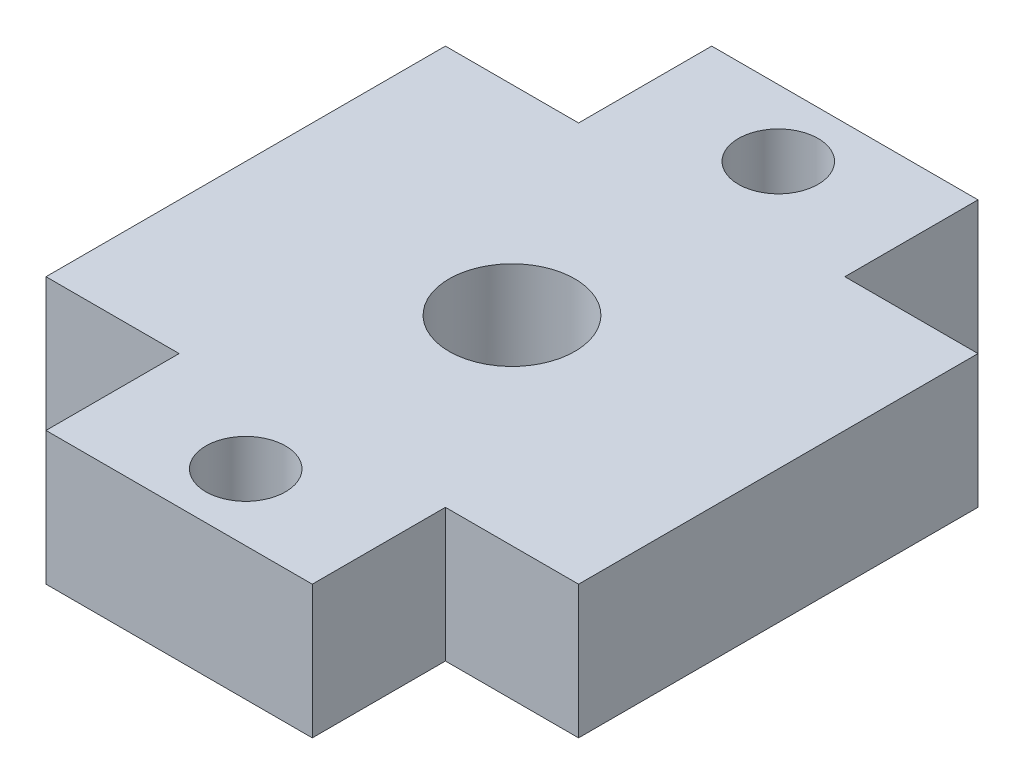
ISO-10303-21;
HEADER;
FILE_DESCRIPTION(('STEP AP214'),'2;1');
FILE_NAME('part.step','',(''),(''),'','','');
FILE_SCHEMA(('AUTOMOTIVE_DESIGN { 1 0 10303 214 1 1 1 1 }'));
ENDSEC;
DATA;
#1=APPLICATION_CONTEXT('core data for automotive mechanical design processes');
#2=APPLICATION_PROTOCOL_DEFINITION('international standard','automotive_design',2000,#1);
#3=PRODUCT_CONTEXT('',#1,'mechanical');
#4=PRODUCT('Part','Part','',(#3));
#5=PRODUCT_RELATED_PRODUCT_CATEGORY('part','',(#4));
#6=PRODUCT_DEFINITION_FORMATION('','',#4);
#7=PRODUCT_DEFINITION_CONTEXT('part definition',#1,'design');
#8=PRODUCT_DEFINITION('design','',#6,#7);
#9=PRODUCT_DEFINITION_SHAPE('','',#8);
#10=(LENGTH_UNIT() NAMED_UNIT(*) SI_UNIT(.MILLI.,.METRE.));
#11=(NAMED_UNIT(*) PLANE_ANGLE_UNIT() SI_UNIT($,.RADIAN.));
#12=(NAMED_UNIT(*) SI_UNIT($,.STERADIAN.) SOLID_ANGLE_UNIT());
#13=UNCERTAINTY_MEASURE_WITH_UNIT(LENGTH_MEASURE(1.E-05),#10,'distance_accuracy_value','');
#14=(GEOMETRIC_REPRESENTATION_CONTEXT(3) GLOBAL_UNCERTAINTY_ASSIGNED_CONTEXT((#13)) GLOBAL_UNIT_ASSIGNED_CONTEXT((#10,
#11,#12)) REPRESENTATION_CONTEXT('',''));
#15=CARTESIAN_POINT('',(0.,0.,0.));
#16=DIRECTION('',(0.,0.,1.));
#17=DIRECTION('',(1.,0.,0.));
#18=AXIS2_PLACEMENT_3D('',#15,#16,#17);
#19=CARTESIAN_POINT('',(0.,3.175,0.));
#20=DIRECTION('',(0.,-1.,0.));
#21=DIRECTION('',(0.,0.,-1.));
#22=AXIS2_PLACEMENT_3D('',#19,#20,#21);
#23=PLANE('',#22);
#24=CARTESIAN_POINT('',(0.,3.175,0.));
#25=DIRECTION('',(0.,1.,0.));
#26=DIRECTION('',(0.,0.,1.));
#27=AXIS2_PLACEMENT_3D('',#24,#25,#26);
#28=CIRCLE('',#27,3.);
#29=CARTESIAN_POINT('',(0.,3.175,3.));
#30=VERTEX_POINT('',#29);
#31=EDGE_CURVE('E415',#30,#30,#28,.T.);
#32=ORIENTED_EDGE('',*,*,#31,.F.);
#33=EDGE_LOOP('',(#32));
#34=FACE_BOUND('',#33,.T.);
#35=CARTESIAN_POINT('',(0.,3.175,-12.7));
#36=DIRECTION('',(0.,1.,0.));
#37=DIRECTION('',(0.,0.,1.));
#38=AXIS2_PLACEMENT_3D('',#35,#36,#37);
#39=CIRCLE('',#38,1.89864999999999);
#40=CARTESIAN_POINT('',(0.,3.175,-10.80135));
#41=VERTEX_POINT('',#40);
#42=EDGE_CURVE('E428',#41,#41,#39,.T.);
#43=ORIENTED_EDGE('',*,*,#42,.F.);
#44=EDGE_LOOP('',(#43));
#45=FACE_BOUND('',#44,.T.);
#46=DIRECTION('',(-1.,0.,0.));
#47=VECTOR('',#46,1.);
#48=CARTESIAN_POINT('',(12.7,3.175,-9.525));
#49=LINE('',#48,#47);
#50=CARTESIAN_POINT('',(12.7,3.175,-9.525));
#51=VERTEX_POINT('',#50);
#52=CARTESIAN_POINT('',(6.34999999999999,3.175,-9.525));
#53=VERTEX_POINT('',#52);
#54=EDGE_CURVE('E152',#51,#53,#49,.T.);
#55=ORIENTED_EDGE('',*,*,#54,.T.);
#56=DIRECTION('',(0.,0.,-1.));
#57=VECTOR('',#56,1.);
#58=CARTESIAN_POINT('',(6.35,3.175,-15.875));
#59=LINE('',#58,#57);
#60=CARTESIAN_POINT('',(6.35,3.175,-15.875));
#61=VERTEX_POINT('',#60);
#62=EDGE_CURVE('E146',#53,#61,#59,.T.);
#63=ORIENTED_EDGE('',*,*,#62,.T.);
#64=DIRECTION('',(-1.,0.,0.));
#65=VECTOR('',#64,1.);
#66=CARTESIAN_POINT('',(-12.7,3.175,-15.875));
#67=LINE('',#66,#65);
#68=CARTESIAN_POINT('',(-6.35,3.175,-15.875));
#69=VERTEX_POINT('',#68);
#70=EDGE_CURVE('E157',#61,#69,#67,.T.);
#71=ORIENTED_EDGE('',*,*,#70,.T.);
#72=DIRECTION('',(0.,0.,-1.));
#73=VECTOR('',#72,1.);
#74=CARTESIAN_POINT('',(-6.35,3.175,-15.875));
#75=LINE('',#74,#73);
#76=CARTESIAN_POINT('',(-6.34999999999999,3.175,-9.525));
#77=VERTEX_POINT('',#76);
#78=EDGE_CURVE('E261',#77,#69,#75,.T.);
#79=ORIENTED_EDGE('',*,*,#78,.F.);
#80=DIRECTION('',(1.,0.,0.));
#81=VECTOR('',#80,1.);
#82=CARTESIAN_POINT('',(-12.7,3.175,-9.525));
#83=LINE('',#82,#81);
#84=CARTESIAN_POINT('',(-12.7,3.175,-9.525));
#85=VERTEX_POINT('',#84);
#86=EDGE_CURVE('E258',#85,#77,#83,.T.);
#87=ORIENTED_EDGE('',*,*,#86,.F.);
#88=DIRECTION('',(0.,0.,1.));
#89=VECTOR('',#88,1.);
#90=CARTESIAN_POINT('',(-12.7,3.175,15.875));
#91=LINE('',#90,#89);
#92=CARTESIAN_POINT('',(-12.7,3.175,9.525));
#93=VERTEX_POINT('',#92);
#94=EDGE_CURVE('E48',#85,#93,#91,.T.);
#95=ORIENTED_EDGE('',*,*,#94,.T.);
#96=DIRECTION('',(1.,0.,0.));
#97=VECTOR('',#96,1.);
#98=CARTESIAN_POINT('',(-12.7,3.175,9.525));
#99=LINE('',#98,#97);
#100=CARTESIAN_POINT('',(-6.34999999999999,3.175,9.525));
#101=VERTEX_POINT('',#100);
#102=EDGE_CURVE('E244',#93,#101,#99,.T.);
#103=ORIENTED_EDGE('',*,*,#102,.T.);
#104=DIRECTION('',(0.,0.,1.));
#105=VECTOR('',#104,1.);
#106=CARTESIAN_POINT('',(-6.35,3.175,15.875));
#107=LINE('',#106,#105);
#108=CARTESIAN_POINT('',(-6.35,3.175,15.875));
#109=VERTEX_POINT('',#108);
#110=EDGE_CURVE('E240',#101,#109,#107,.T.);
#111=ORIENTED_EDGE('',*,*,#110,.T.);
#112=DIRECTION('',(1.,0.,0.));
#113=VECTOR('',#112,1.);
#114=CARTESIAN_POINT('',(-12.7,3.175,15.875));
#115=LINE('',#114,#113);
#116=CARTESIAN_POINT('',(6.35,3.175,15.875));
#117=VERTEX_POINT('',#116);
#118=EDGE_CURVE('E11',#109,#117,#115,.T.);
#119=ORIENTED_EDGE('',*,*,#118,.T.);
#120=DIRECTION('',(0.,0.,1.));
#121=VECTOR('',#120,1.);
#122=CARTESIAN_POINT('',(6.35,3.175,15.875));
#123=LINE('',#122,#121);
#124=CARTESIAN_POINT('',(6.34999999999999,3.175,9.525));
#125=VERTEX_POINT('',#124);
#126=EDGE_CURVE('E218',#125,#117,#123,.T.);
#127=ORIENTED_EDGE('',*,*,#126,.F.);
#128=DIRECTION('',(-1.,0.,0.));
#129=VECTOR('',#128,1.);
#130=CARTESIAN_POINT('',(12.7,3.175,9.525));
#131=LINE('',#130,#129);
#132=CARTESIAN_POINT('',(12.7,3.175,9.525));
#133=VERTEX_POINT('',#132);
#134=EDGE_CURVE('E211',#133,#125,#131,.T.);
#135=ORIENTED_EDGE('',*,*,#134,.F.);
#136=DIRECTION('',(0.,0.,-1.));
#137=VECTOR('',#136,1.);
#138=CARTESIAN_POINT('',(12.7,3.175,15.875));
#139=LINE('',#138,#137);
#140=EDGE_CURVE('E167',#133,#51,#139,.T.);
#141=ORIENTED_EDGE('',*,*,#140,.T.);
#142=EDGE_LOOP('',(#55,#63,#71,#79,#87,#95,#103,#111,#119,#127,#135,#141));
#143=FACE_BOUND('',#142,.T.);
#144=CARTESIAN_POINT('',(0.,3.175,12.7));
#145=DIRECTION('',(0.,1.,0.));
#146=DIRECTION('',(0.,0.,1.));
#147=AXIS2_PLACEMENT_3D('',#144,#145,#146);
#148=CIRCLE('',#147,1.89864999999999);
#149=CARTESIAN_POINT('',(0.,3.175,14.59865));
#150=VERTEX_POINT('',#149);
#151=EDGE_CURVE('E417',#150,#150,#148,.T.);
#152=ORIENTED_EDGE('',*,*,#151,.F.);
#153=EDGE_LOOP('',(#152));
#154=FACE_BOUND('',#153,.T.);
#155=ADVANCED_FACE('F38',(#34,#45,#143,#154),#23,.F.);
#156=CARTESIAN_POINT('',(0.,-3.175,0.));
#157=DIRECTION('',(0.,-1.,0.));
#158=DIRECTION('',(0.,0.,-1.));
#159=AXIS2_PLACEMENT_3D('',#156,#157,#158);
#160=PLANE('',#159);
#161=CARTESIAN_POINT('',(0.,-3.175,0.));
#162=DIRECTION('',(0.,-1.,0.));
#163=DIRECTION('',(0.,0.,-1.));
#164=AXIS2_PLACEMENT_3D('',#161,#162,#163);
#165=CIRCLE('',#164,3.);
#166=CARTESIAN_POINT('',(0.,-3.175,-3.));
#167=VERTEX_POINT('',#166);
#168=EDGE_CURVE('E413',#167,#167,#165,.F.);
#169=ORIENTED_EDGE('',*,*,#168,.T.);
#170=EDGE_LOOP('',(#169));
#171=FACE_BOUND('',#170,.T.);
#172=CARTESIAN_POINT('',(0.,-3.17499999999999,12.7));
#173=DIRECTION('',(0.,1.,0.));
#174=DIRECTION('',(0.,0.,1.));
#175=AXIS2_PLACEMENT_3D('',#172,#173,#174);
#176=CIRCLE('',#175,1.89864999999999);
#177=CARTESIAN_POINT('',(0.,-3.17499999999999,14.59865));
#178=VERTEX_POINT('',#177);
#179=EDGE_CURVE('E422',#178,#178,#176,.T.);
#180=ORIENTED_EDGE('',*,*,#179,.T.);
#181=EDGE_LOOP('',(#180));
#182=FACE_BOUND('',#181,.T.);
#183=CARTESIAN_POINT('',(0.,-3.17499999999999,-12.7));
#184=DIRECTION('',(0.,1.,0.));
#185=DIRECTION('',(0.,0.,1.));
#186=AXIS2_PLACEMENT_3D('',#183,#184,#185);
#187=CIRCLE('',#186,1.89864999999999);
#188=CARTESIAN_POINT('',(0.,-3.17499999999999,-10.80135));
#189=VERTEX_POINT('',#188);
#190=EDGE_CURVE('E313',#189,#189,#187,.T.);
#191=ORIENTED_EDGE('',*,*,#190,.T.);
#192=EDGE_LOOP('',(#191));
#193=FACE_BOUND('',#192,.T.);
#194=DIRECTION('',(0.,0.,-1.));
#195=VECTOR('',#194,1.);
#196=CARTESIAN_POINT('',(6.35,-3.175,-15.875));
#197=LINE('',#196,#195);
#198=CARTESIAN_POINT('',(6.34999999999999,-3.175,-9.525));
#199=VERTEX_POINT('',#198);
#200=CARTESIAN_POINT('',(6.34999999999999,-3.175,-15.875));
#201=VERTEX_POINT('',#200);
#202=EDGE_CURVE('E56',#199,#201,#197,.T.);
#203=ORIENTED_EDGE('',*,*,#202,.F.);
#204=DIRECTION('',(-1.,0.,0.));
#205=VECTOR('',#204,1.);
#206=CARTESIAN_POINT('',(12.7,-3.175,-9.525));
#207=LINE('',#206,#205);
#208=CARTESIAN_POINT('',(12.7,-3.175,-9.525));
#209=VERTEX_POINT('',#208);
#210=EDGE_CURVE('E161',#209,#199,#207,.T.);
#211=ORIENTED_EDGE('',*,*,#210,.F.);
#212=DIRECTION('',(0.,0.,-1.));
#213=VECTOR('',#212,1.);
#214=CARTESIAN_POINT('',(12.7,-3.175,15.875));
#215=LINE('',#214,#213);
#216=CARTESIAN_POINT('',(12.7,-3.175,9.525));
#217=VERTEX_POINT('',#216);
#218=EDGE_CURVE('E176',#217,#209,#215,.T.);
#219=ORIENTED_EDGE('',*,*,#218,.F.);
#220=DIRECTION('',(-1.,0.,0.));
#221=VECTOR('',#220,1.);
#222=CARTESIAN_POINT('',(12.7,-3.175,9.525));
#223=LINE('',#222,#221);
#224=CARTESIAN_POINT('',(6.34999999999999,-3.175,9.525));
#225=VERTEX_POINT('',#224);
#226=EDGE_CURVE('E67',#217,#225,#223,.T.);
#227=ORIENTED_EDGE('',*,*,#226,.T.);
#228=DIRECTION('',(0.,0.,1.));
#229=VECTOR('',#228,1.);
#230=CARTESIAN_POINT('',(6.35,-3.175,15.875));
#231=LINE('',#230,#229);
#232=CARTESIAN_POINT('',(6.34999999999999,-3.175,15.875));
#233=VERTEX_POINT('',#232);
#234=EDGE_CURVE('E207',#225,#233,#231,.T.);
#235=ORIENTED_EDGE('',*,*,#234,.T.);
#236=DIRECTION('',(1.,0.,0.));
#237=VECTOR('',#236,1.);
#238=CARTESIAN_POINT('',(-12.7,-3.175,15.875));
#239=LINE('',#238,#237);
#240=CARTESIAN_POINT('',(-6.35,-3.175,15.875));
#241=VERTEX_POINT('',#240);
#242=EDGE_CURVE('E42',#241,#233,#239,.T.);
#243=ORIENTED_EDGE('',*,*,#242,.F.);
#244=DIRECTION('',(0.,0.,1.));
#245=VECTOR('',#244,1.);
#246=CARTESIAN_POINT('',(-6.35,-3.175,15.875));
#247=LINE('',#246,#245);
#248=CARTESIAN_POINT('',(-6.34999999999999,-3.175,9.525));
#249=VERTEX_POINT('',#248);
#250=EDGE_CURVE('E206',#249,#241,#247,.T.);
#251=ORIENTED_EDGE('',*,*,#250,.F.);
#252=DIRECTION('',(1.,0.,0.));
#253=VECTOR('',#252,1.);
#254=CARTESIAN_POINT('',(-12.7,-3.175,9.525));
#255=LINE('',#254,#253);
#256=CARTESIAN_POINT('',(-12.7,-3.175,9.525));
#257=VERTEX_POINT('',#256);
#258=EDGE_CURVE('E237',#257,#249,#255,.T.);
#259=ORIENTED_EDGE('',*,*,#258,.F.);
#260=DIRECTION('',(0.,0.,1.));
#261=VECTOR('',#260,1.);
#262=CARTESIAN_POINT('',(-12.7,-3.175,15.875));
#263=LINE('',#262,#261);
#264=CARTESIAN_POINT('',(-12.7,-3.175,-9.525));
#265=VERTEX_POINT('',#264);
#266=EDGE_CURVE('E182',#265,#257,#263,.T.);
#267=ORIENTED_EDGE('',*,*,#266,.F.);
#268=DIRECTION('',(1.,0.,0.));
#269=VECTOR('',#268,1.);
#270=CARTESIAN_POINT('',(-12.7,-3.175,-9.525));
#271=LINE('',#270,#269);
#272=CARTESIAN_POINT('',(-6.34999999999999,-3.175,-9.525));
#273=VERTEX_POINT('',#272);
#274=EDGE_CURVE('E181',#265,#273,#271,.T.);
#275=ORIENTED_EDGE('',*,*,#274,.T.);
#276=DIRECTION('',(0.,0.,-1.));
#277=VECTOR('',#276,1.);
#278=CARTESIAN_POINT('',(-6.35,-3.175,-15.875));
#279=LINE('',#278,#277);
#280=CARTESIAN_POINT('',(-6.35,-3.175,-15.875));
#281=VERTEX_POINT('',#280);
#282=EDGE_CURVE('E251',#273,#281,#279,.T.);
#283=ORIENTED_EDGE('',*,*,#282,.T.);
#284=DIRECTION('',(-1.,0.,0.));
#285=VECTOR('',#284,1.);
#286=CARTESIAN_POINT('',(-12.7,-3.175,-15.875));
#287=LINE('',#286,#285);
#288=EDGE_CURVE('E180',#201,#281,#287,.T.);
#289=ORIENTED_EDGE('',*,*,#288,.F.);
#290=EDGE_LOOP('',(#203,#211,#219,#227,#235,#243,#251,#259,#267,#275,#283,#289));
#291=FACE_BOUND('',#290,.T.);
#292=ADVANCED_FACE('F204',(#171,#182,#193,#291),#160,.T.);
#293=CARTESIAN_POINT('',(12.7,3.175,15.875));
#294=DIRECTION('',(-1.,0.,0.));
#295=DIRECTION('',(0.,0.,1.));
#296=AXIS2_PLACEMENT_3D('',#293,#294,#295);
#297=PLANE('',#296);
#298=DIRECTION('',(0.,1.,0.));
#299=VECTOR('',#298,1.);
#300=CARTESIAN_POINT('',(12.7,-3.176,-9.525));
#301=LINE('',#300,#299);
#302=EDGE_CURVE('E212',#209,#51,#301,.T.);
#303=ORIENTED_EDGE('',*,*,#302,.T.);
#304=ORIENTED_EDGE('',*,*,#140,.F.);
#305=DIRECTION('',(0.,1.,0.));
#306=VECTOR('',#305,1.);
#307=CARTESIAN_POINT('',(12.7,-3.176,9.525));
#308=LINE('',#307,#306);
#309=EDGE_CURVE('E227',#217,#133,#308,.T.);
#310=ORIENTED_EDGE('',*,*,#309,.F.);
#311=ORIENTED_EDGE('',*,*,#218,.T.);
#312=EDGE_LOOP('',(#303,#304,#310,#311));
#313=FACE_BOUND('',#312,.T.);
#314=ADVANCED_FACE('F40',(#313),#297,.F.);
#315=CARTESIAN_POINT('',(-12.7,3.175,-15.875));
#316=DIRECTION('',(0.,0.,1.));
#317=DIRECTION('',(1.,0.,0.));
#318=AXIS2_PLACEMENT_3D('',#315,#316,#317);
#319=PLANE('',#318);
#320=DIRECTION('',(0.,1.,0.));
#321=VECTOR('',#320,1.);
#322=CARTESIAN_POINT('',(6.35,-3.176,-15.875));
#323=LINE('',#322,#321);
#324=EDGE_CURVE('E143',#201,#61,#323,.T.);
#325=ORIENTED_EDGE('',*,*,#324,.F.);
#326=ORIENTED_EDGE('',*,*,#288,.T.);
#327=DIRECTION('',(0.,1.,0.));
#328=VECTOR('',#327,1.);
#329=CARTESIAN_POINT('',(-6.35,-3.176,-15.875));
#330=LINE('',#329,#328);
#331=EDGE_CURVE('E166',#281,#69,#330,.T.);
#332=ORIENTED_EDGE('',*,*,#331,.T.);
#333=ORIENTED_EDGE('',*,*,#70,.F.);
#334=EDGE_LOOP('',(#325,#326,#332,#333));
#335=FACE_BOUND('',#334,.T.);
#336=ADVANCED_FACE('F164',(#335),#319,.F.);
#337=CARTESIAN_POINT('',(-12.7,3.175,15.875));
#338=DIRECTION('',(1.,0.,0.));
#339=DIRECTION('',(0.,0.,-1.));
#340=AXIS2_PLACEMENT_3D('',#337,#338,#339);
#341=PLANE('',#340);
#342=DIRECTION('',(0.,1.,0.));
#343=VECTOR('',#342,1.);
#344=CARTESIAN_POINT('',(-12.7,-3.176,9.525));
#345=LINE('',#344,#343);
#346=EDGE_CURVE('E248',#257,#93,#345,.T.);
#347=ORIENTED_EDGE('',*,*,#346,.T.);
#348=ORIENTED_EDGE('',*,*,#94,.F.);
#349=DIRECTION('',(0.,1.,0.));
#350=VECTOR('',#349,1.);
#351=CARTESIAN_POINT('',(-12.7,-3.176,-9.525));
#352=LINE('',#351,#350);
#353=EDGE_CURVE('E263',#265,#85,#352,.T.);
#354=ORIENTED_EDGE('',*,*,#353,.F.);
#355=ORIENTED_EDGE('',*,*,#266,.T.);
#356=EDGE_LOOP('',(#347,#348,#354,#355));
#357=FACE_BOUND('',#356,.T.);
#358=ADVANCED_FACE('F273',(#357),#341,.F.);
#359=CARTESIAN_POINT('',(-12.7,3.175,15.875));
#360=DIRECTION('',(0.,0.,-1.));
#361=DIRECTION('',(-1.,0.,0.));
#362=AXIS2_PLACEMENT_3D('',#359,#360,#361);
#363=PLANE('',#362);
#364=ORIENTED_EDGE('',*,*,#242,.T.);
#365=DIRECTION('',(0.,1.,0.));
#366=VECTOR('',#365,1.);
#367=CARTESIAN_POINT('',(6.35,-3.176,15.875));
#368=LINE('',#367,#366);
#369=EDGE_CURVE('E199',#233,#117,#368,.T.);
#370=ORIENTED_EDGE('',*,*,#369,.T.);
#371=ORIENTED_EDGE('',*,*,#118,.F.);
#372=DIRECTION('',(0.,1.,0.));
#373=VECTOR('',#372,1.);
#374=CARTESIAN_POINT('',(-6.35,-3.176,15.875));
#375=LINE('',#374,#373);
#376=EDGE_CURVE('E200',#241,#109,#375,.T.);
#377=ORIENTED_EDGE('',*,*,#376,.F.);
#378=EDGE_LOOP('',(#364,#370,#371,#377));
#379=FACE_BOUND('',#378,.T.);
#380=ADVANCED_FACE('F197',(#379),#363,.F.);
#381=CARTESIAN_POINT('',(-6.35,-3.176,-15.875));
#382=DIRECTION('',(1.,0.,0.));
#383=DIRECTION('',(0.,0.,-1.));
#384=AXIS2_PLACEMENT_3D('',#381,#382,#383);
#385=PLANE('',#384);
#386=DIRECTION('',(0.,1.,0.));
#387=VECTOR('',#386,1.);
#388=CARTESIAN_POINT('',(-6.34999999999999,-3.176,-9.525));
#389=LINE('',#388,#387);
#390=EDGE_CURVE('E265',#273,#77,#389,.T.);
#391=ORIENTED_EDGE('',*,*,#390,.T.);
#392=ORIENTED_EDGE('',*,*,#78,.T.);
#393=ORIENTED_EDGE('',*,*,#331,.F.);
#394=ORIENTED_EDGE('',*,*,#282,.F.);
#395=EDGE_LOOP('',(#391,#392,#393,#394));
#396=FACE_BOUND('',#395,.T.);
#397=ADVANCED_FACE('F275',(#396),#385,.F.);
#398=CARTESIAN_POINT('',(-12.7,-3.176,-9.525));
#399=DIRECTION('',(0.,0.,1.));
#400=DIRECTION('',(1.,0.,0.));
#401=AXIS2_PLACEMENT_3D('',#398,#399,#400);
#402=PLANE('',#401);
#403=ORIENTED_EDGE('',*,*,#353,.T.);
#404=ORIENTED_EDGE('',*,*,#86,.T.);
#405=ORIENTED_EDGE('',*,*,#390,.F.);
#406=ORIENTED_EDGE('',*,*,#274,.F.);
#407=EDGE_LOOP('',(#403,#404,#405,#406));
#408=FACE_BOUND('',#407,.T.);
#409=ADVANCED_FACE('F270',(#408),#402,.F.);
#410=CARTESIAN_POINT('',(-12.7,-3.176,9.525));
#411=DIRECTION('',(0.,0.,1.));
#412=DIRECTION('',(1.,0.,0.));
#413=AXIS2_PLACEMENT_3D('',#410,#411,#412);
#414=PLANE('',#413);
#415=ORIENTED_EDGE('',*,*,#258,.T.);
#416=DIRECTION('',(0.,1.,0.));
#417=VECTOR('',#416,1.);
#418=CARTESIAN_POINT('',(-6.34999999999999,-3.176,9.525));
#419=LINE('',#418,#417);
#420=EDGE_CURVE('E252',#249,#101,#419,.T.);
#421=ORIENTED_EDGE('',*,*,#420,.T.);
#422=ORIENTED_EDGE('',*,*,#102,.F.);
#423=ORIENTED_EDGE('',*,*,#346,.F.);
#424=EDGE_LOOP('',(#415,#421,#422,#423));
#425=FACE_BOUND('',#424,.T.);
#426=ADVANCED_FACE('F282',(#425),#414,.T.);
#427=CARTESIAN_POINT('',(-6.35,-3.176,15.875));
#428=DIRECTION('',(-1.,0.,0.));
#429=DIRECTION('',(0.,0.,1.));
#430=AXIS2_PLACEMENT_3D('',#427,#428,#429);
#431=PLANE('',#430);
#432=ORIENTED_EDGE('',*,*,#250,.T.);
#433=ORIENTED_EDGE('',*,*,#376,.T.);
#434=ORIENTED_EDGE('',*,*,#110,.F.);
#435=ORIENTED_EDGE('',*,*,#420,.F.);
#436=EDGE_LOOP('',(#432,#433,#434,#435));
#437=FACE_BOUND('',#436,.T.);
#438=ADVANCED_FACE('F334',(#437),#431,.T.);
#439=CARTESIAN_POINT('',(6.35,-3.176,15.875));
#440=DIRECTION('',(-1.,0.,0.));
#441=DIRECTION('',(0.,0.,1.));
#442=AXIS2_PLACEMENT_3D('',#439,#440,#441);
#443=PLANE('',#442);
#444=DIRECTION('',(0.,1.,0.));
#445=VECTOR('',#444,1.);
#446=CARTESIAN_POINT('',(6.34999999999999,-3.176,9.525));
#447=LINE('',#446,#445);
#448=EDGE_CURVE('E229',#225,#125,#447,.T.);
#449=ORIENTED_EDGE('',*,*,#448,.T.);
#450=ORIENTED_EDGE('',*,*,#126,.T.);
#451=ORIENTED_EDGE('',*,*,#369,.F.);
#452=ORIENTED_EDGE('',*,*,#234,.F.);
#453=EDGE_LOOP('',(#449,#450,#451,#452));
#454=FACE_BOUND('',#453,.T.);
#455=ADVANCED_FACE('F328',(#454),#443,.F.);
#456=CARTESIAN_POINT('',(12.7,-3.176,9.525));
#457=DIRECTION('',(0.,0.,-1.));
#458=DIRECTION('',(-1.,0.,0.));
#459=AXIS2_PLACEMENT_3D('',#456,#457,#458);
#460=PLANE('',#459);
#461=ORIENTED_EDGE('',*,*,#309,.T.);
#462=ORIENTED_EDGE('',*,*,#134,.T.);
#463=ORIENTED_EDGE('',*,*,#448,.F.);
#464=ORIENTED_EDGE('',*,*,#226,.F.);
#465=EDGE_LOOP('',(#461,#462,#463,#464));
#466=FACE_BOUND('',#465,.T.);
#467=ADVANCED_FACE('F311',(#466),#460,.F.);
#468=CARTESIAN_POINT('',(12.7,-3.176,-9.525));
#469=DIRECTION('',(0.,0.,-1.));
#470=DIRECTION('',(-1.,0.,0.));
#471=AXIS2_PLACEMENT_3D('',#468,#469,#470);
#472=PLANE('',#471);
#473=ORIENTED_EDGE('',*,*,#210,.T.);
#474=DIRECTION('',(0.,1.,0.));
#475=VECTOR('',#474,1.);
#476=CARTESIAN_POINT('',(6.34999999999999,-3.176,-9.525));
#477=LINE('',#476,#475);
#478=EDGE_CURVE('E151',#199,#53,#477,.T.);
#479=ORIENTED_EDGE('',*,*,#478,.T.);
#480=ORIENTED_EDGE('',*,*,#54,.F.);
#481=ORIENTED_EDGE('',*,*,#302,.F.);
#482=EDGE_LOOP('',(#473,#479,#480,#481));
#483=FACE_BOUND('',#482,.T.);
#484=ADVANCED_FACE('F319',(#483),#472,.T.);
#485=CARTESIAN_POINT('',(6.35,-3.176,-15.875));
#486=DIRECTION('',(1.,0.,0.));
#487=DIRECTION('',(0.,0.,-1.));
#488=AXIS2_PLACEMENT_3D('',#485,#486,#487);
#489=PLANE('',#488);
#490=ORIENTED_EDGE('',*,*,#202,.T.);
#491=ORIENTED_EDGE('',*,*,#324,.T.);
#492=ORIENTED_EDGE('',*,*,#62,.F.);
#493=ORIENTED_EDGE('',*,*,#478,.F.);
#494=EDGE_LOOP('',(#490,#491,#492,#493));
#495=FACE_BOUND('',#494,.T.);
#496=ADVANCED_FACE('F145',(#495),#489,.T.);
#497=CARTESIAN_POINT('',(0.,3.175,-12.7));
#498=DIRECTION('',(0.,1.,0.));
#499=DIRECTION('',(0.,0.,1.));
#500=AXIS2_PLACEMENT_3D('',#497,#498,#499);
#501=CYLINDRICAL_SURFACE('',#500,1.89864999999999);
#502=ORIENTED_EDGE('',*,*,#190,.F.);
#503=EDGE_LOOP('',(#502));
#504=FACE_BOUND('',#503,.T.);
#505=ORIENTED_EDGE('',*,*,#42,.T.);
#506=EDGE_LOOP('',(#505));
#507=FACE_BOUND('',#506,.T.);
#508=ADVANCED_FACE('F326',(#504,#507),#501,.F.);
#509=CARTESIAN_POINT('',(0.,3.175,12.7));
#510=DIRECTION('',(0.,1.,0.));
#511=DIRECTION('',(0.,0.,1.));
#512=AXIS2_PLACEMENT_3D('',#509,#510,#511);
#513=CYLINDRICAL_SURFACE('',#512,1.89864999999999);
#514=ORIENTED_EDGE('',*,*,#179,.F.);
#515=EDGE_LOOP('',(#514));
#516=FACE_BOUND('',#515,.T.);
#517=ORIENTED_EDGE('',*,*,#151,.T.);
#518=EDGE_LOOP('',(#517));
#519=FACE_BOUND('',#518,.T.);
#520=ADVANCED_FACE('F375',(#516,#519),#513,.F.);
#521=CARTESIAN_POINT('',(0.,-3.176,0.));
#522=DIRECTION('',(0.,1.,0.));
#523=DIRECTION('',(0.,0.,1.));
#524=AXIS2_PLACEMENT_3D('',#521,#522,#523);
#525=CYLINDRICAL_SURFACE('',#524,3.);
#526=ORIENTED_EDGE('',*,*,#168,.F.);
#527=EDGE_LOOP('',(#526));
#528=FACE_BOUND('',#527,.T.);
#529=ORIENTED_EDGE('',*,*,#31,.T.);
#530=EDGE_LOOP('',(#529));
#531=FACE_BOUND('',#530,.T.);
#532=ADVANCED_FACE('F385',(#528,#531),#525,.F.);
#533=CLOSED_SHELL('',(#155,#292,#314,#336,#358,#380,#397,#409,#426,#438,#455,#467,#484,#496,
#508,#520,#532));
#534=MANIFOLD_SOLID_BREP('B2',#533);
#535=ADVANCED_BREP_SHAPE_REPRESENTATION('',(#18,#534),#14);
#536=SHAPE_DEFINITION_REPRESENTATION(#9,#535);
ENDSEC;
END-ISO-10303-21;
